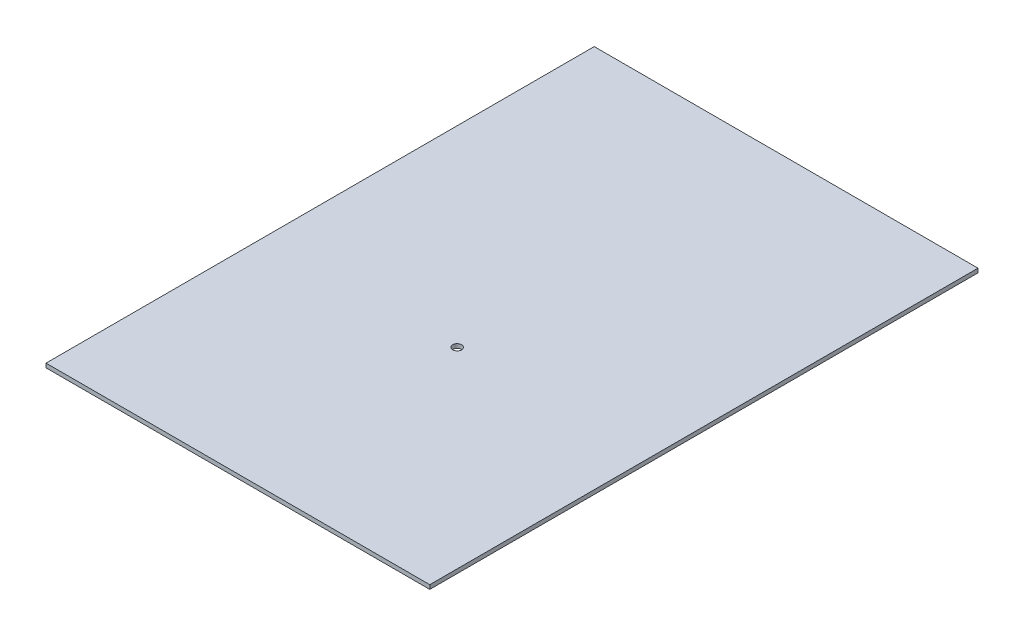
ISO-10303-21;
HEADER;
FILE_DESCRIPTION(('STEP AP214'),'2;1');
FILE_NAME('part.step','',(''),(''),'','','');
FILE_SCHEMA(('AUTOMOTIVE_DESIGN { 1 0 10303 214 1 1 1 1 }'));
ENDSEC;
DATA;
#1=APPLICATION_CONTEXT('core data for automotive mechanical design processes');
#2=APPLICATION_PROTOCOL_DEFINITION('international standard','automotive_design',2000,#1);
#3=PRODUCT_CONTEXT('',#1,'mechanical');
#4=PRODUCT('Part','Part','',(#3));
#5=PRODUCT_RELATED_PRODUCT_CATEGORY('part','',(#4));
#6=PRODUCT_DEFINITION_FORMATION('','',#4);
#7=PRODUCT_DEFINITION_CONTEXT('part definition',#1,'design');
#8=PRODUCT_DEFINITION('design','',#6,#7);
#9=PRODUCT_DEFINITION_SHAPE('','',#8);
#10=(LENGTH_UNIT() NAMED_UNIT(*) SI_UNIT(.MILLI.,.METRE.));
#11=(NAMED_UNIT(*) PLANE_ANGLE_UNIT() SI_UNIT($,.RADIAN.));
#12=(NAMED_UNIT(*) SI_UNIT($,.STERADIAN.) SOLID_ANGLE_UNIT());
#13=UNCERTAINTY_MEASURE_WITH_UNIT(LENGTH_MEASURE(1.E-05),#10,'distance_accuracy_value','');
#14=(GEOMETRIC_REPRESENTATION_CONTEXT(3) GLOBAL_UNCERTAINTY_ASSIGNED_CONTEXT((#13)) GLOBAL_UNIT_ASSIGNED_CONTEXT((#10,
#11,#12)) REPRESENTATION_CONTEXT('',''));
#15=CARTESIAN_POINT('',(0.,0.,0.));
#16=DIRECTION('',(0.,0.,1.));
#17=DIRECTION('',(1.,0.,0.));
#18=AXIS2_PLACEMENT_3D('',#15,#16,#17);
#19=CARTESIAN_POINT('',(0.,3.,0.));
#20=DIRECTION('',(0.,-1.,0.));
#21=DIRECTION('',(0.,0.,-1.));
#22=AXIS2_PLACEMENT_3D('',#19,#20,#21);
#23=PLANE('',#22);
#24=DIRECTION('',(0.,0.,1.));
#25=VECTOR('',#24,1.);
#26=CARTESIAN_POINT('',(0.,3.,0.));
#27=LINE('',#26,#25);
#28=CARTESIAN_POINT('',(0.,3.,-400.));
#29=VERTEX_POINT('',#28);
#30=CARTESIAN_POINT('',(0.,3.,0.));
#31=VERTEX_POINT('',#30);
#32=EDGE_CURVE('E85',#29,#31,#27,.T.);
#33=ORIENTED_EDGE('',*,*,#32,.T.);
#34=DIRECTION('',(1.,0.,0.));
#35=VECTOR('',#34,1.);
#36=CARTESIAN_POINT('',(0.,3.,0.));
#37=LINE('',#36,#35);
#38=CARTESIAN_POINT('',(280.,3.,0.));
#39=VERTEX_POINT('',#38);
#40=EDGE_CURVE('E80',#31,#39,#37,.T.);
#41=ORIENTED_EDGE('',*,*,#40,.T.);
#42=DIRECTION('',(0.,0.,-1.));
#43=VECTOR('',#42,1.);
#44=CARTESIAN_POINT('',(280.,3.,0.));
#45=LINE('',#44,#43);
#46=CARTESIAN_POINT('',(280.,3.,-400.));
#47=VERTEX_POINT('',#46);
#48=EDGE_CURVE('E83',#39,#47,#45,.T.);
#49=ORIENTED_EDGE('',*,*,#48,.T.);
#50=DIRECTION('',(-1.,0.,0.));
#51=VECTOR('',#50,1.);
#52=CARTESIAN_POINT('',(0.,3.,-400.));
#53=LINE('',#52,#51);
#54=EDGE_CURVE('E50',#47,#29,#53,.T.);
#55=ORIENTED_EDGE('',*,*,#54,.T.);
#56=EDGE_LOOP('',(#33,#41,#49,#55));
#57=FACE_BOUND('',#56,.T.);
#58=CARTESIAN_POINT('',(140.,3.,-160.));
#59=DIRECTION('',(0.,1.,0.));
#60=DIRECTION('',(0.,0.,1.));
#61=AXIS2_PLACEMENT_3D('',#58,#59,#60);
#62=CIRCLE('',#61,3.25000000000001);
#63=CARTESIAN_POINT('',(140.,3.,-156.75));
#64=VERTEX_POINT('',#63);
#65=EDGE_CURVE('E100',#64,#64,#62,.T.);
#66=ORIENTED_EDGE('',*,*,#65,.F.);
#67=EDGE_LOOP('',(#66));
#68=FACE_BOUND('',#67,.T.);
#69=ADVANCED_FACE('F33',(#57,#68),#23,.F.);
#70=CARTESIAN_POINT('',(0.,0.,0.));
#71=DIRECTION('',(0.,-1.,0.));
#72=DIRECTION('',(0.,0.,-1.));
#73=AXIS2_PLACEMENT_3D('',#70,#71,#72);
#74=PLANE('',#73);
#75=DIRECTION('',(0.,0.,1.));
#76=VECTOR('',#75,1.);
#77=CARTESIAN_POINT('',(0.,0.,0.));
#78=LINE('',#77,#76);
#79=CARTESIAN_POINT('',(0.,0.,-400.));
#80=VERTEX_POINT('',#79);
#81=CARTESIAN_POINT('',(0.,0.,0.));
#82=VERTEX_POINT('',#81);
#83=EDGE_CURVE('E97',#80,#82,#78,.T.);
#84=ORIENTED_EDGE('',*,*,#83,.F.);
#85=DIRECTION('',(-1.,0.,0.));
#86=VECTOR('',#85,1.);
#87=CARTESIAN_POINT('',(0.,0.,-400.));
#88=LINE('',#87,#86);
#89=CARTESIAN_POINT('',(280.,0.,-400.));
#90=VERTEX_POINT('',#89);
#91=EDGE_CURVE('E73',#90,#80,#88,.T.);
#92=ORIENTED_EDGE('',*,*,#91,.F.);
#93=DIRECTION('',(0.,0.,-1.));
#94=VECTOR('',#93,1.);
#95=CARTESIAN_POINT('',(280.,0.,0.));
#96=LINE('',#95,#94);
#97=CARTESIAN_POINT('',(280.,0.,0.));
#98=VERTEX_POINT('',#97);
#99=EDGE_CURVE('E67',#98,#90,#96,.T.);
#100=ORIENTED_EDGE('',*,*,#99,.F.);
#101=DIRECTION('',(1.,0.,0.));
#102=VECTOR('',#101,1.);
#103=CARTESIAN_POINT('',(0.,0.,0.));
#104=LINE('',#103,#102);
#105=EDGE_CURVE('E89',#82,#98,#104,.T.);
#106=ORIENTED_EDGE('',*,*,#105,.F.);
#107=EDGE_LOOP('',(#84,#92,#100,#106));
#108=FACE_BOUND('',#107,.T.);
#109=CARTESIAN_POINT('',(140.,0.,-160.));
#110=DIRECTION('',(0.,1.,0.));
#111=DIRECTION('',(0.,0.,1.));
#112=AXIS2_PLACEMENT_3D('',#109,#110,#111);
#113=CIRCLE('',#112,3.25000000000001);
#114=CARTESIAN_POINT('',(140.,0.,-156.75));
#115=VERTEX_POINT('',#114);
#116=EDGE_CURVE('E112',#115,#115,#113,.T.);
#117=ORIENTED_EDGE('',*,*,#116,.T.);
#118=EDGE_LOOP('',(#117));
#119=FACE_BOUND('',#118,.T.);
#120=ADVANCED_FACE('F108',(#108,#119),#74,.T.);
#121=CARTESIAN_POINT('',(0.,3.,0.));
#122=DIRECTION('',(1.,0.,0.));
#123=DIRECTION('',(0.,0.,-1.));
#124=AXIS2_PLACEMENT_3D('',#121,#122,#123);
#125=PLANE('',#124);
#126=ORIENTED_EDGE('',*,*,#83,.T.);
#127=DIRECTION('',(0.,-1.,0.));
#128=VECTOR('',#127,1.);
#129=CARTESIAN_POINT('',(0.,3.,0.));
#130=LINE('',#129,#128);
#131=EDGE_CURVE('E11',#31,#82,#130,.T.);
#132=ORIENTED_EDGE('',*,*,#131,.F.);
#133=ORIENTED_EDGE('',*,*,#32,.F.);
#134=DIRECTION('',(0.,-1.,0.));
#135=VECTOR('',#134,1.);
#136=CARTESIAN_POINT('',(0.,3.,-400.));
#137=LINE('',#136,#135);
#138=EDGE_CURVE('E93',#29,#80,#137,.T.);
#139=ORIENTED_EDGE('',*,*,#138,.T.);
#140=EDGE_LOOP('',(#126,#132,#133,#139));
#141=FACE_BOUND('',#140,.T.);
#142=ADVANCED_FACE('F35',(#141),#125,.F.);
#143=CARTESIAN_POINT('',(0.,3.,0.));
#144=DIRECTION('',(0.,0.,-1.));
#145=DIRECTION('',(-1.,0.,0.));
#146=AXIS2_PLACEMENT_3D('',#143,#144,#145);
#147=PLANE('',#146);
#148=ORIENTED_EDGE('',*,*,#105,.T.);
#149=DIRECTION('',(0.,-1.,0.));
#150=VECTOR('',#149,1.);
#151=CARTESIAN_POINT('',(280.,3.,0.));
#152=LINE('',#151,#150);
#153=EDGE_CURVE('E42',#39,#98,#152,.T.);
#154=ORIENTED_EDGE('',*,*,#153,.F.);
#155=ORIENTED_EDGE('',*,*,#40,.F.);
#156=ORIENTED_EDGE('',*,*,#131,.T.);
#157=EDGE_LOOP('',(#148,#154,#155,#156));
#158=FACE_BOUND('',#157,.T.);
#159=ADVANCED_FACE('F88',(#158),#147,.F.);
#160=CARTESIAN_POINT('',(280.,3.,0.));
#161=DIRECTION('',(-1.,0.,0.));
#162=DIRECTION('',(0.,0.,1.));
#163=AXIS2_PLACEMENT_3D('',#160,#161,#162);
#164=PLANE('',#163);
#165=ORIENTED_EDGE('',*,*,#99,.T.);
#166=DIRECTION('',(0.,-1.,0.));
#167=VECTOR('',#166,1.);
#168=CARTESIAN_POINT('',(280.,3.,-400.));
#169=LINE('',#168,#167);
#170=EDGE_CURVE('E90',#47,#90,#169,.T.);
#171=ORIENTED_EDGE('',*,*,#170,.F.);
#172=ORIENTED_EDGE('',*,*,#48,.F.);
#173=ORIENTED_EDGE('',*,*,#153,.T.);
#174=EDGE_LOOP('',(#165,#171,#172,#173));
#175=FACE_BOUND('',#174,.T.);
#176=ADVANCED_FACE('F91',(#175),#164,.F.);
#177=CARTESIAN_POINT('',(0.,3.,-400.));
#178=DIRECTION('',(0.,0.,1.));
#179=DIRECTION('',(1.,0.,0.));
#180=AXIS2_PLACEMENT_3D('',#177,#178,#179);
#181=PLANE('',#180);
#182=ORIENTED_EDGE('',*,*,#91,.T.);
#183=ORIENTED_EDGE('',*,*,#138,.F.);
#184=ORIENTED_EDGE('',*,*,#54,.F.);
#185=ORIENTED_EDGE('',*,*,#170,.T.);
#186=EDGE_LOOP('',(#182,#183,#184,#185));
#187=FACE_BOUND('',#186,.T.);
#188=ADVANCED_FACE('F105',(#187),#181,.F.);
#189=CARTESIAN_POINT('',(140.,3.,-160.));
#190=DIRECTION('',(0.,-1.,0.));
#191=DIRECTION('',(0.,0.,-1.));
#192=AXIS2_PLACEMENT_3D('',#189,#190,#191);
#193=CYLINDRICAL_SURFACE('',#192,3.25000000000001);
#194=ORIENTED_EDGE('',*,*,#65,.T.);
#195=EDGE_LOOP('',(#194));
#196=FACE_BOUND('',#195,.T.);
#197=ORIENTED_EDGE('',*,*,#116,.F.);
#198=EDGE_LOOP('',(#197));
#199=FACE_BOUND('',#198,.T.);
#200=ADVANCED_FACE('F118',(#196,#199),#193,.F.);
#201=CLOSED_SHELL('',(#69,#120,#142,#159,#176,#188,#200));
#202=MANIFOLD_SOLID_BREP('B2',#201);
#203=ADVANCED_BREP_SHAPE_REPRESENTATION('',(#18,#202),#14);
#204=SHAPE_DEFINITION_REPRESENTATION(#9,#203);
ENDSEC;
END-ISO-10303-21;
